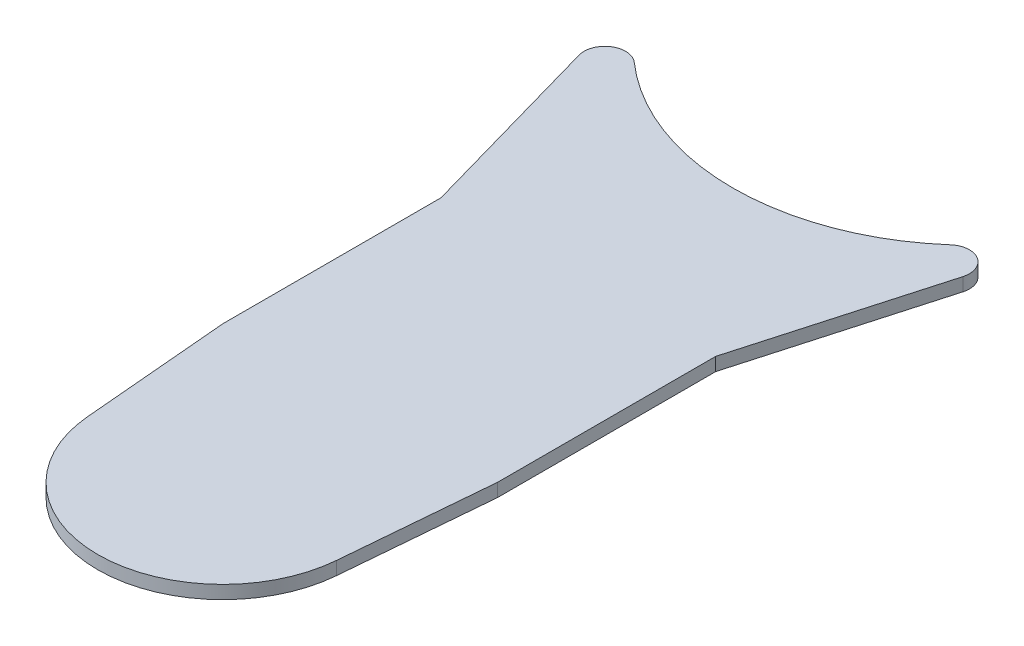
ISO-10303-21;
HEADER;
FILE_DESCRIPTION(('STEP AP214'),'2;1');
FILE_NAME('part.step','',(''),(''),'','','');
FILE_SCHEMA(('AUTOMOTIVE_DESIGN { 1 0 10303 214 1 1 1 1 }'));
ENDSEC;
DATA;
#1=APPLICATION_CONTEXT('core data for automotive mechanical design processes');
#2=APPLICATION_PROTOCOL_DEFINITION('international standard','automotive_design',2000,#1);
#3=PRODUCT_CONTEXT('',#1,'mechanical');
#4=PRODUCT('Part','Part','',(#3));
#5=PRODUCT_RELATED_PRODUCT_CATEGORY('part','',(#4));
#6=PRODUCT_DEFINITION_FORMATION('','',#4);
#7=PRODUCT_DEFINITION_CONTEXT('part definition',#1,'design');
#8=PRODUCT_DEFINITION('design','',#6,#7);
#9=PRODUCT_DEFINITION_SHAPE('','',#8);
#10=(LENGTH_UNIT() NAMED_UNIT(*) SI_UNIT(.MILLI.,.METRE.));
#11=(NAMED_UNIT(*) PLANE_ANGLE_UNIT() SI_UNIT($,.RADIAN.));
#12=(NAMED_UNIT(*) SI_UNIT($,.STERADIAN.) SOLID_ANGLE_UNIT());
#13=UNCERTAINTY_MEASURE_WITH_UNIT(LENGTH_MEASURE(1.E-05),#10,'distance_accuracy_value','');
#14=(GEOMETRIC_REPRESENTATION_CONTEXT(3) GLOBAL_UNCERTAINTY_ASSIGNED_CONTEXT((#13)) GLOBAL_UNIT_ASSIGNED_CONTEXT((#10,
#11,#12)) REPRESENTATION_CONTEXT('',''));
#15=CARTESIAN_POINT('',(0.,0.,0.));
#16=DIRECTION('',(0.,0.,1.));
#17=DIRECTION('',(1.,0.,0.));
#18=AXIS2_PLACEMENT_3D('',#15,#16,#17);
#19=CARTESIAN_POINT('',(0.,-3.175,180.));
#20=DIRECTION('',(0.,1.,0.));
#21=DIRECTION('',(0.,0.,1.));
#22=AXIS2_PLACEMENT_3D('',#19,#20,#21);
#23=CYLINDRICAL_SURFACE('',#22,30.);
#24=CARTESIAN_POINT('',(0.,0.,180.));
#25=DIRECTION('',(0.,1.,0.));
#26=DIRECTION('',(0.,0.,1.));
#27=AXIS2_PLACEMENT_3D('',#24,#25,#26);
#28=CIRCLE('',#27,30.);
#29=CARTESIAN_POINT('',(-29.8872999569822,0.,182.59794173941));
#30=VERTEX_POINT('',#29);
#31=CARTESIAN_POINT('',(29.8872999569823,0.,182.59794173941));
#32=VERTEX_POINT('',#31);
#33=EDGE_CURVE('E151',#30,#32,#28,.T.);
#34=ORIENTED_EDGE('',*,*,#33,.F.);
#35=DIRECTION('',(0.,1.,0.));
#36=VECTOR('',#35,1.);
#37=CARTESIAN_POINT('',(-29.8872999569822,-3.175,182.59794173941));
#38=LINE('',#37,#36);
#39=CARTESIAN_POINT('',(-29.8872999569822,-3.175,182.59794173941));
#40=VERTEX_POINT('',#39);
#41=EDGE_CURVE('E11',#40,#30,#38,.T.);
#42=ORIENTED_EDGE('',*,*,#41,.F.);
#43=CARTESIAN_POINT('',(0.,-3.175,180.));
#44=DIRECTION('',(0.,1.,0.));
#45=DIRECTION('',(0.,0.,1.));
#46=AXIS2_PLACEMENT_3D('',#43,#44,#45);
#47=CIRCLE('',#46,30.);
#48=CARTESIAN_POINT('',(29.8872999569823,-3.175,182.59794173941));
#49=VERTEX_POINT('',#48);
#50=EDGE_CURVE('E177',#40,#49,#47,.T.);
#51=ORIENTED_EDGE('',*,*,#50,.T.);
#52=DIRECTION('',(0.,1.,0.));
#53=VECTOR('',#52,1.);
#54=CARTESIAN_POINT('',(29.8872999569823,-3.175,182.59794173941));
#55=LINE('',#54,#53);
#56=EDGE_CURVE('E45',#49,#32,#55,.T.);
#57=ORIENTED_EDGE('',*,*,#56,.T.);
#58=EDGE_LOOP('',(#34,#42,#51,#57));
#59=FACE_BOUND('',#58,.T.);
#60=ADVANCED_FACE('F42',(#59),#23,.T.);
#61=CARTESIAN_POINT('',(-29.8872999569822,-3.175,182.59794173941));
#62=DIRECTION('',(-0.996243331899408,0.,0.0865980579803408));
#63=DIRECTION('',(0.0865980579803408,0.,0.996243331899408));
#64=AXIS2_PLACEMENT_3D('',#61,#62,#63);
#65=PLANE('',#64);
#66=DIRECTION('',(0.0865980579803408,0.,0.996243331899408));
#67=VECTOR('',#66,1.);
#68=CARTESIAN_POINT('',(-29.8872999569822,0.,182.59794173941));
#69=LINE('',#68,#67);
#70=CARTESIAN_POINT('',(-32.9857333167532,0.,146.952874794522));
#71=VERTEX_POINT('',#70);
#72=EDGE_CURVE('E175',#71,#30,#69,.T.);
#73=ORIENTED_EDGE('',*,*,#72,.F.);
#74=DIRECTION('',(0.,1.,0.));
#75=VECTOR('',#74,1.);
#76=CARTESIAN_POINT('',(-32.9857333167532,-3.175,146.952874794522));
#77=LINE('',#76,#75);
#78=CARTESIAN_POINT('',(-32.9857333167532,-3.175,146.952874794522));
#79=VERTEX_POINT('',#78);
#80=EDGE_CURVE('E51',#79,#71,#77,.T.);
#81=ORIENTED_EDGE('',*,*,#80,.F.);
#82=DIRECTION('',(0.0865980579803408,0.,0.996243331899408));
#83=VECTOR('',#82,1.);
#84=CARTESIAN_POINT('',(-29.8872999569822,-3.175,182.59794173941));
#85=LINE('',#84,#83);
#86=EDGE_CURVE('E141',#79,#40,#85,.T.);
#87=ORIENTED_EDGE('',*,*,#86,.T.);
#88=ORIENTED_EDGE('',*,*,#41,.T.);
#89=EDGE_LOOP('',(#73,#81,#87,#88));
#90=FACE_BOUND('',#89,.T.);
#91=ADVANCED_FACE('F193',(#90),#65,.T.);
#92=CARTESIAN_POINT('',(-32.9857333167532,-3.175,146.952874794522));
#93=DIRECTION('',(-1.,0.,0.));
#94=DIRECTION('',(0.,0.,1.));
#95=AXIS2_PLACEMENT_3D('',#92,#93,#94);
#96=PLANE('',#95);
#97=DIRECTION('',(0.,0.,1.));
#98=VECTOR('',#97,1.);
#99=CARTESIAN_POINT('',(-32.9857333167532,0.,146.952874794522));
#100=LINE('',#99,#98);
#101=CARTESIAN_POINT('',(-32.9857333167532,0.,94.5716509987882));
#102=VERTEX_POINT('',#101);
#103=EDGE_CURVE('E128',#102,#71,#100,.T.);
#104=ORIENTED_EDGE('',*,*,#103,.F.);
#105=DIRECTION('',(0.,1.,0.));
#106=VECTOR('',#105,1.);
#107=CARTESIAN_POINT('',(-32.9857333167532,-3.175,94.5716509987882));
#108=LINE('',#107,#106);
#109=CARTESIAN_POINT('',(-32.9857333167532,-3.175,94.5716509987882));
#110=VERTEX_POINT('',#109);
#111=EDGE_CURVE('E123',#110,#102,#108,.T.);
#112=ORIENTED_EDGE('',*,*,#111,.F.);
#113=DIRECTION('',(0.,0.,1.));
#114=VECTOR('',#113,1.);
#115=CARTESIAN_POINT('',(-32.9857333167532,-3.175,146.952874794522));
#116=LINE('',#115,#114);
#117=EDGE_CURVE('E126',#110,#79,#116,.T.);
#118=ORIENTED_EDGE('',*,*,#117,.T.);
#119=ORIENTED_EDGE('',*,*,#80,.T.);
#120=EDGE_LOOP('',(#104,#112,#118,#119));
#121=FACE_BOUND('',#120,.T.);
#122=ADVANCED_FACE('F125',(#121),#96,.T.);
#123=CARTESIAN_POINT('',(-32.9857333167532,-3.175,94.5716509987882));
#124=DIRECTION('',(-0.962182988795009,0.,0.272403920811548));
#125=DIRECTION('',(0.272403920811548,0.,0.962182988795009));
#126=AXIS2_PLACEMENT_3D('',#123,#124,#125);
#127=PLANE('',#126);
#128=DIRECTION('',(0.272403920811548,0.,0.962182988795009));
#129=VECTOR('',#128,1.);
#130=CARTESIAN_POINT('',(-32.9857333167532,0.,94.5716509987882));
#131=LINE('',#130,#129);
#132=CARTESIAN_POINT('',(-46.0878554575078,0.,48.2924381174514));
#133=VERTEX_POINT('',#132);
#134=EDGE_CURVE('E172',#133,#102,#131,.T.);
#135=ORIENTED_EDGE('',*,*,#134,.F.);
#136=DIRECTION('',(0.,1.,0.));
#137=VECTOR('',#136,1.);
#138=CARTESIAN_POINT('',(-46.0878554575078,-3.175,48.2924381174514));
#139=LINE('',#138,#137);
#140=CARTESIAN_POINT('',(-46.0878554575078,-3.175,48.2924381174514));
#141=VERTEX_POINT('',#140);
#142=EDGE_CURVE('E133',#141,#133,#139,.T.);
#143=ORIENTED_EDGE('',*,*,#142,.F.);
#144=DIRECTION('',(0.272403920811548,0.,0.962182988795009));
#145=VECTOR('',#144,1.);
#146=CARTESIAN_POINT('',(-32.9857333167532,-3.175,94.5716509987882));
#147=LINE('',#146,#145);
#148=EDGE_CURVE('E139',#141,#110,#147,.T.);
#149=ORIENTED_EDGE('',*,*,#148,.T.);
#150=ORIENTED_EDGE('',*,*,#111,.T.);
#151=EDGE_LOOP('',(#135,#143,#149,#150));
#152=FACE_BOUND('',#151,.T.);
#153=ADVANCED_FACE('F143',(#152),#127,.T.);
#154=CARTESIAN_POINT('',(-41.2769405135327,-3.175,46.9304185133936));
#155=DIRECTION('',(0.,1.,0.));
#156=DIRECTION('',(0.,0.,1.));
#157=AXIS2_PLACEMENT_3D('',#154,#155,#156);
#158=CYLINDRICAL_SURFACE('',#157,5.);
#159=CARTESIAN_POINT('',(-41.2769405135327,0.,46.9304185133936));
#160=DIRECTION('',(0.,1.,0.));
#161=DIRECTION('',(0.,0.,-1.));
#162=AXIS2_PLACEMENT_3D('',#159,#160,#161);
#163=CIRCLE('',#162,5.);
#164=CARTESIAN_POINT('',(-37.9747852724501,0.,43.1759850323221));
#165=VERTEX_POINT('',#164);
#166=EDGE_CURVE('E169',#165,#133,#163,.T.);
#167=ORIENTED_EDGE('',*,*,#166,.F.);
#168=DIRECTION('',(0.,1.,0.));
#169=VECTOR('',#168,1.);
#170=CARTESIAN_POINT('',(-37.9747852724501,-3.175,43.1759850323221));
#171=LINE('',#170,#169);
#172=CARTESIAN_POINT('',(-37.9747852724501,-3.175,43.1759850323221));
#173=VERTEX_POINT('',#172);
#174=EDGE_CURVE('E181',#173,#165,#171,.T.);
#175=ORIENTED_EDGE('',*,*,#174,.F.);
#176=CARTESIAN_POINT('',(-41.2769405135327,-3.175,46.9304185133936));
#177=DIRECTION('',(0.,1.,0.));
#178=DIRECTION('',(0.,0.,-1.));
#179=AXIS2_PLACEMENT_3D('',#176,#177,#178);
#180=CIRCLE('',#179,5.);
#181=EDGE_CURVE('E144',#173,#141,#180,.T.);
#182=ORIENTED_EDGE('',*,*,#181,.T.);
#183=ORIENTED_EDGE('',*,*,#142,.T.);
#184=EDGE_LOOP('',(#167,#175,#182,#183));
#185=FACE_BOUND('',#184,.T.);
#186=ADVANCED_FACE('F206',(#185),#158,.T.);
#187=CARTESIAN_POINT('',(0.,-3.175,0.));
#188=DIRECTION('',(0.,1.,0.));
#189=DIRECTION('',(0.,0.,1.));
#190=AXIS2_PLACEMENT_3D('',#187,#188,#189);
#191=CYLINDRICAL_SURFACE('',#190,57.5);
#192=CARTESIAN_POINT('',(0.,0.,0.));
#193=DIRECTION('',(0.,-1.,0.));
#194=DIRECTION('',(0.,0.,1.));
#195=AXIS2_PLACEMENT_3D('',#192,#193,#194);
#196=CIRCLE('',#195,57.5);
#197=CARTESIAN_POINT('',(37.9747852724501,0.,43.1759850323222));
#198=VERTEX_POINT('',#197);
#199=EDGE_CURVE('E166',#198,#165,#196,.T.);
#200=ORIENTED_EDGE('',*,*,#199,.F.);
#201=DIRECTION('',(0.,1.,0.));
#202=VECTOR('',#201,1.);
#203=CARTESIAN_POINT('',(37.9747852724501,-3.175,43.1759850323222));
#204=LINE('',#203,#202);
#205=CARTESIAN_POINT('',(37.9747852724501,-3.175,43.1759850323222));
#206=VERTEX_POINT('',#205);
#207=EDGE_CURVE('E183',#206,#198,#204,.T.);
#208=ORIENTED_EDGE('',*,*,#207,.F.);
#209=CARTESIAN_POINT('',(0.,-3.175,0.));
#210=DIRECTION('',(0.,-1.,0.));
#211=DIRECTION('',(0.,0.,1.));
#212=AXIS2_PLACEMENT_3D('',#209,#210,#211);
#213=CIRCLE('',#212,57.5);
#214=EDGE_CURVE('E146',#206,#173,#213,.T.);
#215=ORIENTED_EDGE('',*,*,#214,.T.);
#216=ORIENTED_EDGE('',*,*,#174,.T.);
#217=EDGE_LOOP('',(#200,#208,#215,#216));
#218=FACE_BOUND('',#217,.T.);
#219=ADVANCED_FACE('F209',(#218),#191,.F.);
#220=CARTESIAN_POINT('',(41.2769405135327,-3.175,46.9304185133936));
#221=DIRECTION('',(0.,1.,0.));
#222=DIRECTION('',(0.,0.,1.));
#223=AXIS2_PLACEMENT_3D('',#220,#221,#222);
#224=CYLINDRICAL_SURFACE('',#223,4.99999999999999);
#225=CARTESIAN_POINT('',(41.2769405135327,0.,46.9304185133936));
#226=DIRECTION('',(0.,1.,0.));
#227=DIRECTION('',(0.,0.,1.));
#228=AXIS2_PLACEMENT_3D('',#225,#226,#227);
#229=CIRCLE('',#228,4.99999999999999);
#230=CARTESIAN_POINT('',(46.0878554575077,0.,48.2924381174514));
#231=VERTEX_POINT('',#230);
#232=EDGE_CURVE('E163',#231,#198,#229,.T.);
#233=ORIENTED_EDGE('',*,*,#232,.F.);
#234=DIRECTION('',(0.,1.,0.));
#235=VECTOR('',#234,1.);
#236=CARTESIAN_POINT('',(46.0878554575077,-3.175,48.2924381174514));
#237=LINE('',#236,#235);
#238=CARTESIAN_POINT('',(46.0878554575077,-3.175,48.2924381174514));
#239=VERTEX_POINT('',#238);
#240=EDGE_CURVE('E185',#239,#231,#237,.T.);
#241=ORIENTED_EDGE('',*,*,#240,.F.);
#242=CARTESIAN_POINT('',(41.2769405135327,-3.175,46.9304185133936));
#243=DIRECTION('',(0.,1.,0.));
#244=DIRECTION('',(0.,0.,1.));
#245=AXIS2_PLACEMENT_3D('',#242,#243,#244);
#246=CIRCLE('',#245,4.99999999999999);
#247=EDGE_CURVE('E332',#239,#206,#246,.T.);
#248=ORIENTED_EDGE('',*,*,#247,.T.);
#249=ORIENTED_EDGE('',*,*,#207,.T.);
#250=EDGE_LOOP('',(#233,#241,#248,#249));
#251=FACE_BOUND('',#250,.T.);
#252=ADVANCED_FACE('F213',(#251),#224,.T.);
#253=CARTESIAN_POINT('',(32.9857333167532,-3.175,94.5716509987882));
#254=DIRECTION('',(0.962182988795009,0.,0.272403920811549));
#255=DIRECTION('',(0.272403920811549,0.,-0.962182988795009));
#256=AXIS2_PLACEMENT_3D('',#253,#254,#255);
#257=PLANE('',#256);
#258=DIRECTION('',(0.272403920811549,0.,-0.962182988795009));
#259=VECTOR('',#258,1.);
#260=CARTESIAN_POINT('',(32.9857333167532,0.,94.5716509987882));
#261=LINE('',#260,#259);
#262=CARTESIAN_POINT('',(32.9857333167532,0.,94.5716509987882));
#263=VERTEX_POINT('',#262);
#264=EDGE_CURVE('E160',#263,#231,#261,.T.);
#265=ORIENTED_EDGE('',*,*,#264,.F.);
#266=DIRECTION('',(0.,1.,0.));
#267=VECTOR('',#266,1.);
#268=CARTESIAN_POINT('',(32.9857333167532,-3.175,94.5716509987882));
#269=LINE('',#268,#267);
#270=CARTESIAN_POINT('',(32.9857333167532,-3.175,94.5716509987882));
#271=VERTEX_POINT('',#270);
#272=EDGE_CURVE('E187',#271,#263,#269,.T.);
#273=ORIENTED_EDGE('',*,*,#272,.F.);
#274=DIRECTION('',(0.272403920811549,0.,-0.962182988795009));
#275=VECTOR('',#274,1.);
#276=CARTESIAN_POINT('',(32.9857333167532,-3.175,94.5716509987882));
#277=LINE('',#276,#275);
#278=EDGE_CURVE('E328',#271,#239,#277,.T.);
#279=ORIENTED_EDGE('',*,*,#278,.T.);
#280=ORIENTED_EDGE('',*,*,#240,.T.);
#281=EDGE_LOOP('',(#265,#273,#279,#280));
#282=FACE_BOUND('',#281,.T.);
#283=ADVANCED_FACE('F217',(#282),#257,.T.);
#284=CARTESIAN_POINT('',(32.9857333167532,-3.175,146.952874794522));
#285=DIRECTION('',(1.,0.,0.));
#286=DIRECTION('',(0.,0.,-1.));
#287=AXIS2_PLACEMENT_3D('',#284,#285,#286);
#288=PLANE('',#287);
#289=DIRECTION('',(0.,0.,-1.));
#290=VECTOR('',#289,1.);
#291=CARTESIAN_POINT('',(32.9857333167532,0.,146.952874794522));
#292=LINE('',#291,#290);
#293=CARTESIAN_POINT('',(32.9857333167532,0.,146.952874794522));
#294=VERTEX_POINT('',#293);
#295=EDGE_CURVE('E157',#294,#263,#292,.T.);
#296=ORIENTED_EDGE('',*,*,#295,.F.);
#297=DIRECTION('',(0.,1.,0.));
#298=VECTOR('',#297,1.);
#299=CARTESIAN_POINT('',(32.9857333167532,-3.175,146.952874794522));
#300=LINE('',#299,#298);
#301=CARTESIAN_POINT('',(32.9857333167532,-3.175,146.952874794522));
#302=VERTEX_POINT('',#301);
#303=EDGE_CURVE('E188',#302,#294,#300,.T.);
#304=ORIENTED_EDGE('',*,*,#303,.F.);
#305=DIRECTION('',(0.,0.,-1.));
#306=VECTOR('',#305,1.);
#307=CARTESIAN_POINT('',(32.9857333167532,-3.175,146.952874794522));
#308=LINE('',#307,#306);
#309=EDGE_CURVE('E339',#302,#271,#308,.T.);
#310=ORIENTED_EDGE('',*,*,#309,.T.);
#311=ORIENTED_EDGE('',*,*,#272,.T.);
#312=EDGE_LOOP('',(#296,#304,#310,#311));
#313=FACE_BOUND('',#312,.T.);
#314=ADVANCED_FACE('F221',(#313),#288,.T.);
#315=CARTESIAN_POINT('',(29.8872999569823,-3.175,182.59794173941));
#316=DIRECTION('',(0.996243331899408,0.,0.0865980579803384));
#317=DIRECTION('',(0.0865980579803384,0.,-0.996243331899408));
#318=AXIS2_PLACEMENT_3D('',#315,#316,#317);
#319=PLANE('',#318);
#320=DIRECTION('',(0.0865980579803384,0.,-0.996243331899408));
#321=VECTOR('',#320,1.);
#322=CARTESIAN_POINT('',(29.8872999569823,0.,182.59794173941));
#323=LINE('',#322,#321);
#324=EDGE_CURVE('E154',#32,#294,#323,.T.);
#325=ORIENTED_EDGE('',*,*,#324,.F.);
#326=ORIENTED_EDGE('',*,*,#56,.F.);
#327=DIRECTION('',(0.0865980579803384,0.,-0.996243331899408));
#328=VECTOR('',#327,1.);
#329=CARTESIAN_POINT('',(29.8872999569823,-3.175,182.59794173941));
#330=LINE('',#329,#328);
#331=EDGE_CURVE('E341',#49,#302,#330,.T.);
#332=ORIENTED_EDGE('',*,*,#331,.T.);
#333=ORIENTED_EDGE('',*,*,#303,.T.);
#334=EDGE_LOOP('',(#325,#326,#332,#333));
#335=FACE_BOUND('',#334,.T.);
#336=ADVANCED_FACE('F190',(#335),#319,.T.);
#337=CARTESIAN_POINT('',(0.,-3.175,180.));
#338=DIRECTION('',(0.,1.,0.));
#339=DIRECTION('',(0.,0.,1.));
#340=AXIS2_PLACEMENT_3D('',#337,#338,#339);
#341=PLANE('',#340);
#342=ORIENTED_EDGE('',*,*,#50,.F.);
#343=ORIENTED_EDGE('',*,*,#86,.F.);
#344=ORIENTED_EDGE('',*,*,#117,.F.);
#345=ORIENTED_EDGE('',*,*,#148,.F.);
#346=ORIENTED_EDGE('',*,*,#181,.F.);
#347=ORIENTED_EDGE('',*,*,#214,.F.);
#348=ORIENTED_EDGE('',*,*,#247,.F.);
#349=ORIENTED_EDGE('',*,*,#278,.F.);
#350=ORIENTED_EDGE('',*,*,#309,.F.);
#351=ORIENTED_EDGE('',*,*,#331,.F.);
#352=EDGE_LOOP('',(#342,#343,#344,#345,#346,#347,#348,#349,#350,#351));
#353=FACE_BOUND('',#352,.T.);
#354=ADVANCED_FACE('F137',(#353),#341,.F.);
#355=CARTESIAN_POINT('',(0.,0.,180.));
#356=DIRECTION('',(0.,1.,0.));
#357=DIRECTION('',(0.,0.,1.));
#358=AXIS2_PLACEMENT_3D('',#355,#356,#357);
#359=PLANE('',#358);
#360=ORIENTED_EDGE('',*,*,#33,.T.);
#361=ORIENTED_EDGE('',*,*,#324,.T.);
#362=ORIENTED_EDGE('',*,*,#295,.T.);
#363=ORIENTED_EDGE('',*,*,#264,.T.);
#364=ORIENTED_EDGE('',*,*,#232,.T.);
#365=ORIENTED_EDGE('',*,*,#199,.T.);
#366=ORIENTED_EDGE('',*,*,#166,.T.);
#367=ORIENTED_EDGE('',*,*,#134,.T.);
#368=ORIENTED_EDGE('',*,*,#103,.T.);
#369=ORIENTED_EDGE('',*,*,#72,.T.);
#370=EDGE_LOOP('',(#360,#361,#362,#363,#364,#365,#366,#367,#368,#369));
#371=FACE_BOUND('',#370,.T.);
#372=ADVANCED_FACE('F192',(#371),#359,.T.);
#373=CLOSED_SHELL('',(#60,#91,#122,#153,#186,#219,#252,#283,#314,#336,#354,#372));
#374=MANIFOLD_SOLID_BREP('B2',#373);
#375=ADVANCED_BREP_SHAPE_REPRESENTATION('',(#18,#374),#14);
#376=SHAPE_DEFINITION_REPRESENTATION(#9,#375);
ENDSEC;
END-ISO-10303-21;
